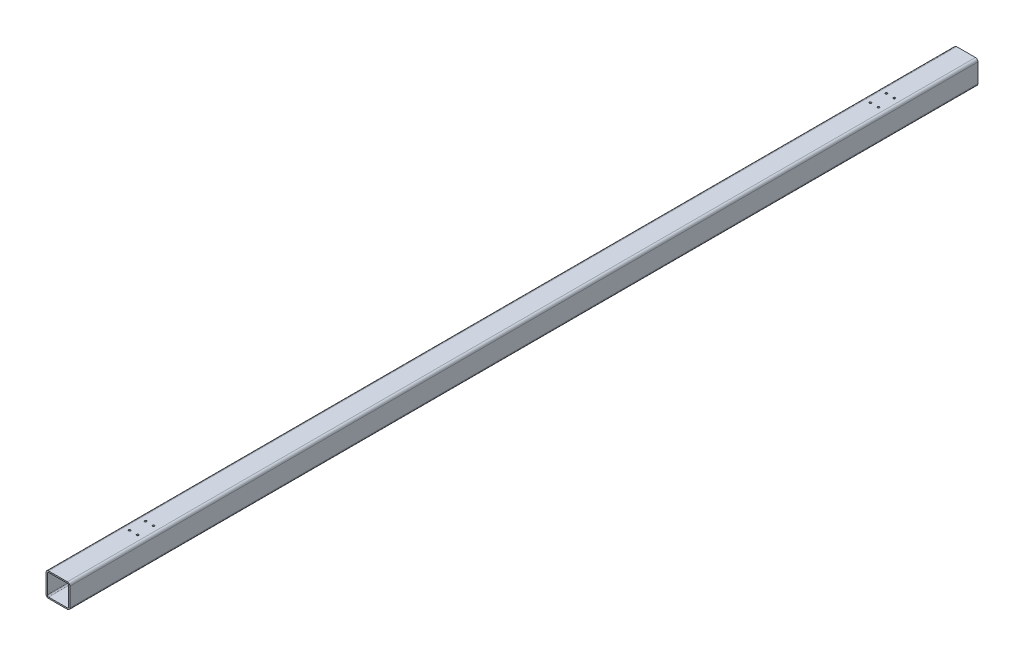
ISO-10303-21;
HEADER;
FILE_DESCRIPTION(('STEP AP214'),'2;1');
FILE_NAME('part.step','',(''),(''),'','','');
FILE_SCHEMA(('AUTOMOTIVE_DESIGN { 1 0 10303 214 1 1 1 1 }'));
ENDSEC;
DATA;
#1=APPLICATION_CONTEXT('core data for automotive mechanical design processes');
#2=APPLICATION_PROTOCOL_DEFINITION('international standard','automotive_design',2000,#1);
#3=PRODUCT_CONTEXT('',#1,'mechanical');
#4=PRODUCT('Part','Part','',(#3));
#5=PRODUCT_RELATED_PRODUCT_CATEGORY('part','',(#4));
#6=PRODUCT_DEFINITION_FORMATION('','',#4);
#7=PRODUCT_DEFINITION_CONTEXT('part definition',#1,'design');
#8=PRODUCT_DEFINITION('design','',#6,#7);
#9=PRODUCT_DEFINITION_SHAPE('','',#8);
#10=(LENGTH_UNIT() NAMED_UNIT(*) SI_UNIT(.MILLI.,.METRE.));
#11=(NAMED_UNIT(*) PLANE_ANGLE_UNIT() SI_UNIT($,.RADIAN.));
#12=(NAMED_UNIT(*) SI_UNIT($,.STERADIAN.) SOLID_ANGLE_UNIT());
#13=UNCERTAINTY_MEASURE_WITH_UNIT(LENGTH_MEASURE(1.E-05),#10,'distance_accuracy_value','');
#14=(GEOMETRIC_REPRESENTATION_CONTEXT(3) GLOBAL_UNCERTAINTY_ASSIGNED_CONTEXT((#13)) GLOBAL_UNIT_ASSIGNED_CONTEXT((#10,
#11,#12)) REPRESENTATION_CONTEXT('',''));
#15=CARTESIAN_POINT('',(0.,0.,0.));
#16=DIRECTION('',(0.,0.,1.));
#17=DIRECTION('',(1.,0.,0.));
#18=AXIS2_PLACEMENT_3D('',#15,#16,#17);
#19=CARTESIAN_POINT('',(649.999999999995,-30.,999.999999999987));
#20=DIRECTION('',(0.,-1.,0.));
#21=DIRECTION('',(0.,0.,-1.));
#22=AXIS2_PLACEMENT_3D('',#19,#20,#21);
#23=CYLINDRICAL_SURFACE('',#22,2.49999999999995);
#24=CARTESIAN_POINT('',(649.999999999995,-26.7999999999999,999.999999999987));
#25=DIRECTION('',(0.,-1.,0.));
#26=DIRECTION('',(0.,0.,-1.));
#27=AXIS2_PLACEMENT_3D('',#24,#25,#26);
#28=CIRCLE('',#27,2.49999999999995);
#29=CARTESIAN_POINT('',(649.999999999995,-26.7999999999999,997.499999999987));
#30=VERTEX_POINT('',#29);
#31=EDGE_CURVE('E20',#30,#30,#28,.T.);
#32=ORIENTED_EDGE('',*,*,#31,.F.);
#33=EDGE_LOOP('',(#32));
#34=FACE_BOUND('',#33,.T.);
#35=CARTESIAN_POINT('',(649.999999999995,-30.,999.999999999987));
#36=DIRECTION('',(0.,-1.,0.));
#37=DIRECTION('',(0.,0.,-1.));
#38=AXIS2_PLACEMENT_3D('',#35,#36,#37);
#39=CIRCLE('',#38,2.49999999999995);
#40=CARTESIAN_POINT('',(649.999999999995,-30.,997.499999999987));
#41=VERTEX_POINT('',#40);
#42=EDGE_CURVE('E186',#41,#41,#39,.T.);
#43=ORIENTED_EDGE('',*,*,#42,.T.);
#44=EDGE_LOOP('',(#43));
#45=FACE_BOUND('',#44,.T.);
#46=ADVANCED_FACE('F17',(#34,#45),#23,.F.);
#47=CARTESIAN_POINT('',(649.999999999995,-30.,499.999999999986));
#48=DIRECTION('',(0.,-1.,0.));
#49=DIRECTION('',(0.,0.,-1.));
#50=AXIS2_PLACEMENT_3D('',#47,#48,#49);
#51=CYLINDRICAL_SURFACE('',#50,2.49999999999995);
#52=CARTESIAN_POINT('',(649.999999999995,-26.7999999999999,499.999999999986));
#53=DIRECTION('',(0.,-1.,0.));
#54=DIRECTION('',(0.,0.,-1.));
#55=AXIS2_PLACEMENT_3D('',#52,#53,#54);
#56=CIRCLE('',#55,2.49999999999995);
#57=CARTESIAN_POINT('',(649.999999999995,-26.7999999999999,497.499999999986));
#58=VERTEX_POINT('',#57);
#59=EDGE_CURVE('E304',#58,#58,#56,.T.);
#60=ORIENTED_EDGE('',*,*,#59,.F.);
#61=EDGE_LOOP('',(#60));
#62=FACE_BOUND('',#61,.T.);
#63=CARTESIAN_POINT('',(649.999999999995,-30.,499.999999999986));
#64=DIRECTION('',(0.,-1.,0.));
#65=DIRECTION('',(0.,0.,-1.));
#66=AXIS2_PLACEMENT_3D('',#63,#64,#65);
#67=CIRCLE('',#66,2.49999999999995);
#68=CARTESIAN_POINT('',(649.999999999995,-30.,497.499999999986));
#69=VERTEX_POINT('',#68);
#70=EDGE_CURVE('E270',#69,#69,#67,.T.);
#71=ORIENTED_EDGE('',*,*,#70,.T.);
#72=EDGE_LOOP('',(#71));
#73=FACE_BOUND('',#72,.T.);
#74=ADVANCED_FACE('F315',(#62,#73),#51,.F.);
#75=CARTESIAN_POINT('',(650.000000000009,-30.,0.));
#76=DIRECTION('',(0.,-1.,0.));
#77=DIRECTION('',(0.,0.,-1.));
#78=AXIS2_PLACEMENT_3D('',#75,#76,#77);
#79=CYLINDRICAL_SURFACE('',#78,2.49999999999995);
#80=CARTESIAN_POINT('',(650.000000000009,-26.7999999999999,0.));
#81=DIRECTION('',(0.,-1.,0.));
#82=DIRECTION('',(0.,0.,-1.));
#83=AXIS2_PLACEMENT_3D('',#80,#81,#82);
#84=CIRCLE('',#83,2.49999999999995);
#85=CARTESIAN_POINT('',(650.000000000009,-26.7999999999999,-2.49999999999998));
#86=VERTEX_POINT('',#85);
#87=EDGE_CURVE('E302',#86,#86,#84,.T.);
#88=ORIENTED_EDGE('',*,*,#87,.F.);
#89=EDGE_LOOP('',(#88));
#90=FACE_BOUND('',#89,.T.);
#91=CARTESIAN_POINT('',(650.000000000009,-30.,0.));
#92=DIRECTION('',(0.,-1.,0.));
#93=DIRECTION('',(0.,0.,-1.));
#94=AXIS2_PLACEMENT_3D('',#91,#92,#93);
#95=CIRCLE('',#94,2.49999999999995);
#96=CARTESIAN_POINT('',(650.000000000009,-30.,-2.49999999999998));
#97=VERTEX_POINT('',#96);
#98=EDGE_CURVE('E267',#97,#97,#95,.T.);
#99=ORIENTED_EDGE('',*,*,#98,.T.);
#100=EDGE_LOOP('',(#99));
#101=FACE_BOUND('',#100,.T.);
#102=ADVANCED_FACE('F483',(#90,#101),#79,.F.);
#103=CARTESIAN_POINT('',(649.999999999995,-30.,-500.000000000014));
#104=DIRECTION('',(0.,-1.,0.));
#105=DIRECTION('',(0.,0.,-1.));
#106=AXIS2_PLACEMENT_3D('',#103,#104,#105);
#107=CYLINDRICAL_SURFACE('',#106,2.49999999999995);
#108=CARTESIAN_POINT('',(649.999999999995,-26.7999999999999,-500.000000000014));
#109=DIRECTION('',(0.,-1.,0.));
#110=DIRECTION('',(0.,0.,-1.));
#111=AXIS2_PLACEMENT_3D('',#108,#109,#110);
#112=CIRCLE('',#111,2.49999999999995);
#113=CARTESIAN_POINT('',(649.999999999995,-26.7999999999999,-502.500000000014));
#114=VERTEX_POINT('',#113);
#115=EDGE_CURVE('E299',#114,#114,#112,.T.);
#116=ORIENTED_EDGE('',*,*,#115,.F.);
#117=EDGE_LOOP('',(#116));
#118=FACE_BOUND('',#117,.T.);
#119=CARTESIAN_POINT('',(649.999999999995,-30.,-500.000000000014));
#120=DIRECTION('',(0.,-1.,0.));
#121=DIRECTION('',(0.,0.,-1.));
#122=AXIS2_PLACEMENT_3D('',#119,#120,#121);
#123=CIRCLE('',#122,2.49999999999995);
#124=CARTESIAN_POINT('',(649.999999999995,-30.,-502.500000000014));
#125=VERTEX_POINT('',#124);
#126=EDGE_CURVE('E264',#125,#125,#123,.T.);
#127=ORIENTED_EDGE('',*,*,#126,.T.);
#128=EDGE_LOOP('',(#127));
#129=FACE_BOUND('',#128,.T.);
#130=ADVANCED_FACE('F479',(#118,#129),#107,.F.);
#131=CARTESIAN_POINT('',(649.999999999995,-30.,-1000.));
#132=DIRECTION('',(0.,-1.,0.));
#133=DIRECTION('',(0.,0.,-1.));
#134=AXIS2_PLACEMENT_3D('',#131,#132,#133);
#135=CYLINDRICAL_SURFACE('',#134,2.49999999999995);
#136=CARTESIAN_POINT('',(649.999999999995,-26.7999999999999,-1000.));
#137=DIRECTION('',(0.,-1.,0.));
#138=DIRECTION('',(0.,0.,-1.));
#139=AXIS2_PLACEMENT_3D('',#136,#137,#138);
#140=CIRCLE('',#139,2.49999999999995);
#141=CARTESIAN_POINT('',(649.999999999995,-26.7999999999999,-1002.5));
#142=VERTEX_POINT('',#141);
#143=EDGE_CURVE('E200',#142,#142,#140,.T.);
#144=ORIENTED_EDGE('',*,*,#143,.F.);
#145=EDGE_LOOP('',(#144));
#146=FACE_BOUND('',#145,.T.);
#147=CARTESIAN_POINT('',(649.999999999995,-30.,-1000.));
#148=DIRECTION('',(0.,-1.,0.));
#149=DIRECTION('',(0.,0.,-1.));
#150=AXIS2_PLACEMENT_3D('',#147,#148,#149);
#151=CIRCLE('',#150,2.49999999999995);
#152=CARTESIAN_POINT('',(649.999999999995,-30.,-1002.5));
#153=VERTEX_POINT('',#152);
#154=EDGE_CURVE('E182',#153,#153,#151,.T.);
#155=ORIENTED_EDGE('',*,*,#154,.T.);
#156=EDGE_LOOP('',(#155));
#157=FACE_BOUND('',#156,.T.);
#158=ADVANCED_FACE('F475',(#146,#157),#135,.F.);
#159=CARTESIAN_POINT('',(660.,40.,-950.));
#160=DIRECTION('',(0.,1.,0.));
#161=DIRECTION('',(0.,0.,1.));
#162=AXIS2_PLACEMENT_3D('',#159,#160,#161);
#163=CYLINDRICAL_SURFACE('',#162,2.49999999999995);
#164=CARTESIAN_POINT('',(660.,30.,-950.));
#165=DIRECTION('',(0.,1.,0.));
#166=DIRECTION('',(0.,0.,1.));
#167=AXIS2_PLACEMENT_3D('',#164,#165,#166);
#168=CIRCLE('',#167,2.49999999999995);
#169=CARTESIAN_POINT('',(660.,30.,-947.5));
#170=VERTEX_POINT('',#169);
#171=EDGE_CURVE('E176',#170,#170,#168,.T.);
#172=ORIENTED_EDGE('',*,*,#171,.T.);
#173=EDGE_LOOP('',(#172));
#174=FACE_BOUND('',#173,.T.);
#175=CARTESIAN_POINT('',(660.,26.7999999999999,-950.));
#176=DIRECTION('',(0.,1.,0.));
#177=DIRECTION('',(0.,0.,1.));
#178=AXIS2_PLACEMENT_3D('',#175,#176,#177);
#179=CIRCLE('',#178,2.49999999999995);
#180=CARTESIAN_POINT('',(660.,26.7999999999999,-947.5));
#181=VERTEX_POINT('',#180);
#182=EDGE_CURVE('E142',#181,#181,#179,.T.);
#183=ORIENTED_EDGE('',*,*,#182,.F.);
#184=EDGE_LOOP('',(#183));
#185=FACE_BOUND('',#184,.T.);
#186=ADVANCED_FACE('F471',(#174,#185),#163,.F.);
#187=CARTESIAN_POINT('',(680.,40.,-950.));
#188=DIRECTION('',(0.,1.,0.));
#189=DIRECTION('',(0.,0.,1.));
#190=AXIS2_PLACEMENT_3D('',#187,#188,#189);
#191=CYLINDRICAL_SURFACE('',#190,2.49999999999995);
#192=CARTESIAN_POINT('',(680.,30.,-950.));
#193=DIRECTION('',(0.,1.,0.));
#194=DIRECTION('',(0.,0.,1.));
#195=AXIS2_PLACEMENT_3D('',#192,#193,#194);
#196=CIRCLE('',#195,2.49999999999995);
#197=CARTESIAN_POINT('',(680.,30.,-947.5));
#198=VERTEX_POINT('',#197);
#199=EDGE_CURVE('E257',#198,#198,#196,.T.);
#200=ORIENTED_EDGE('',*,*,#199,.T.);
#201=EDGE_LOOP('',(#200));
#202=FACE_BOUND('',#201,.T.);
#203=CARTESIAN_POINT('',(680.,26.7999999999999,-950.));
#204=DIRECTION('',(0.,1.,0.));
#205=DIRECTION('',(0.,0.,1.));
#206=AXIS2_PLACEMENT_3D('',#203,#204,#205);
#207=CIRCLE('',#206,2.49999999999995);
#208=CARTESIAN_POINT('',(680.,26.7999999999999,-947.5));
#209=VERTEX_POINT('',#208);
#210=EDGE_CURVE('E292',#209,#209,#207,.T.);
#211=ORIENTED_EDGE('',*,*,#210,.F.);
#212=EDGE_LOOP('',(#211));
#213=FACE_BOUND('',#212,.T.);
#214=ADVANCED_FACE('F467',(#202,#213),#191,.F.);
#215=CARTESIAN_POINT('',(660.,40.,-910.));
#216=DIRECTION('',(0.,1.,0.));
#217=DIRECTION('',(0.,0.,1.));
#218=AXIS2_PLACEMENT_3D('',#215,#216,#217);
#219=CYLINDRICAL_SURFACE('',#218,2.49999999999995);
#220=CARTESIAN_POINT('',(660.,30.,-910.));
#221=DIRECTION('',(0.,1.,0.));
#222=DIRECTION('',(0.,0.,1.));
#223=AXIS2_PLACEMENT_3D('',#220,#221,#222);
#224=CIRCLE('',#223,2.49999999999995);
#225=CARTESIAN_POINT('',(660.,30.,-907.5));
#226=VERTEX_POINT('',#225);
#227=EDGE_CURVE('E254',#226,#226,#224,.T.);
#228=ORIENTED_EDGE('',*,*,#227,.T.);
#229=EDGE_LOOP('',(#228));
#230=FACE_BOUND('',#229,.T.);
#231=CARTESIAN_POINT('',(660.,26.7999999999999,-910.));
#232=DIRECTION('',(0.,1.,0.));
#233=DIRECTION('',(0.,0.,1.));
#234=AXIS2_PLACEMENT_3D('',#231,#232,#233);
#235=CIRCLE('',#234,2.49999999999995);
#236=CARTESIAN_POINT('',(660.,26.7999999999999,-907.5));
#237=VERTEX_POINT('',#236);
#238=EDGE_CURVE('E289',#237,#237,#235,.T.);
#239=ORIENTED_EDGE('',*,*,#238,.F.);
#240=EDGE_LOOP('',(#239));
#241=FACE_BOUND('',#240,.T.);
#242=ADVANCED_FACE('F463',(#230,#241),#219,.F.);
#243=CARTESIAN_POINT('',(680.,40.,-910.));
#244=DIRECTION('',(0.,1.,0.));
#245=DIRECTION('',(0.,0.,1.));
#246=AXIS2_PLACEMENT_3D('',#243,#244,#245);
#247=CYLINDRICAL_SURFACE('',#246,2.49999999999995);
#248=CARTESIAN_POINT('',(680.,30.,-910.));
#249=DIRECTION('',(0.,1.,0.));
#250=DIRECTION('',(0.,0.,1.));
#251=AXIS2_PLACEMENT_3D('',#248,#249,#250);
#252=CIRCLE('',#251,2.49999999999995);
#253=CARTESIAN_POINT('',(680.,30.,-907.5));
#254=VERTEX_POINT('',#253);
#255=EDGE_CURVE('E251',#254,#254,#252,.T.);
#256=ORIENTED_EDGE('',*,*,#255,.T.);
#257=EDGE_LOOP('',(#256));
#258=FACE_BOUND('',#257,.T.);
#259=CARTESIAN_POINT('',(680.,26.7999999999999,-910.));
#260=DIRECTION('',(0.,1.,0.));
#261=DIRECTION('',(0.,0.,1.));
#262=AXIS2_PLACEMENT_3D('',#259,#260,#261);
#263=CIRCLE('',#262,2.49999999999995);
#264=CARTESIAN_POINT('',(680.,26.7999999999999,-907.5));
#265=VERTEX_POINT('',#264);
#266=EDGE_CURVE('E286',#265,#265,#263,.T.);
#267=ORIENTED_EDGE('',*,*,#266,.F.);
#268=EDGE_LOOP('',(#267));
#269=FACE_BOUND('',#268,.T.);
#270=ADVANCED_FACE('F459',(#258,#269),#247,.F.);
#271=CARTESIAN_POINT('',(660.,40.,910.));
#272=DIRECTION('',(0.,1.,0.));
#273=DIRECTION('',(0.,0.,1.));
#274=AXIS2_PLACEMENT_3D('',#271,#272,#273);
#275=CYLINDRICAL_SURFACE('',#274,2.49999999999995);
#276=CARTESIAN_POINT('',(660.,30.,910.));
#277=DIRECTION('',(0.,1.,0.));
#278=DIRECTION('',(0.,0.,1.));
#279=AXIS2_PLACEMENT_3D('',#276,#277,#278);
#280=CIRCLE('',#279,2.49999999999995);
#281=CARTESIAN_POINT('',(660.,30.,912.5));
#282=VERTEX_POINT('',#281);
#283=EDGE_CURVE('E248',#282,#282,#280,.T.);
#284=ORIENTED_EDGE('',*,*,#283,.T.);
#285=EDGE_LOOP('',(#284));
#286=FACE_BOUND('',#285,.T.);
#287=CARTESIAN_POINT('',(660.,26.7999999999999,910.));
#288=DIRECTION('',(0.,1.,0.));
#289=DIRECTION('',(0.,0.,1.));
#290=AXIS2_PLACEMENT_3D('',#287,#288,#289);
#291=CIRCLE('',#290,2.49999999999995);
#292=CARTESIAN_POINT('',(660.,26.7999999999999,912.5));
#293=VERTEX_POINT('',#292);
#294=EDGE_CURVE('E283',#293,#293,#291,.T.);
#295=ORIENTED_EDGE('',*,*,#294,.F.);
#296=EDGE_LOOP('',(#295));
#297=FACE_BOUND('',#296,.T.);
#298=ADVANCED_FACE('F455',(#286,#297),#275,.F.);
#299=CARTESIAN_POINT('',(680.,40.,910.));
#300=DIRECTION('',(0.,1.,0.));
#301=DIRECTION('',(0.,0.,1.));
#302=AXIS2_PLACEMENT_3D('',#299,#300,#301);
#303=CYLINDRICAL_SURFACE('',#302,2.49999999999995);
#304=CARTESIAN_POINT('',(680.,30.,910.));
#305=DIRECTION('',(0.,1.,0.));
#306=DIRECTION('',(0.,0.,1.));
#307=AXIS2_PLACEMENT_3D('',#304,#305,#306);
#308=CIRCLE('',#307,2.49999999999995);
#309=CARTESIAN_POINT('',(680.,30.,912.5));
#310=VERTEX_POINT('',#309);
#311=EDGE_CURVE('E245',#310,#310,#308,.T.);
#312=ORIENTED_EDGE('',*,*,#311,.T.);
#313=EDGE_LOOP('',(#312));
#314=FACE_BOUND('',#313,.T.);
#315=CARTESIAN_POINT('',(680.,26.7999999999999,910.));
#316=DIRECTION('',(0.,1.,0.));
#317=DIRECTION('',(0.,0.,1.));
#318=AXIS2_PLACEMENT_3D('',#315,#316,#317);
#319=CIRCLE('',#318,2.49999999999995);
#320=CARTESIAN_POINT('',(680.,26.7999999999999,912.5));
#321=VERTEX_POINT('',#320);
#322=EDGE_CURVE('E280',#321,#321,#319,.T.);
#323=ORIENTED_EDGE('',*,*,#322,.F.);
#324=EDGE_LOOP('',(#323));
#325=FACE_BOUND('',#324,.T.);
#326=ADVANCED_FACE('F451',(#314,#325),#303,.F.);
#327=CARTESIAN_POINT('',(660.,40.,950.));
#328=DIRECTION('',(0.,1.,0.));
#329=DIRECTION('',(0.,0.,1.));
#330=AXIS2_PLACEMENT_3D('',#327,#328,#329);
#331=CYLINDRICAL_SURFACE('',#330,2.49999999999995);
#332=CARTESIAN_POINT('',(660.,30.,950.));
#333=DIRECTION('',(0.,1.,0.));
#334=DIRECTION('',(0.,0.,1.));
#335=AXIS2_PLACEMENT_3D('',#332,#333,#334);
#336=CIRCLE('',#335,2.49999999999995);
#337=CARTESIAN_POINT('',(660.,30.,952.5));
#338=VERTEX_POINT('',#337);
#339=EDGE_CURVE('E242',#338,#338,#336,.T.);
#340=ORIENTED_EDGE('',*,*,#339,.T.);
#341=EDGE_LOOP('',(#340));
#342=FACE_BOUND('',#341,.T.);
#343=CARTESIAN_POINT('',(660.,26.7999999999999,950.));
#344=DIRECTION('',(0.,1.,0.));
#345=DIRECTION('',(0.,0.,1.));
#346=AXIS2_PLACEMENT_3D('',#343,#344,#345);
#347=CIRCLE('',#346,2.49999999999995);
#348=CARTESIAN_POINT('',(660.,26.7999999999999,952.5));
#349=VERTEX_POINT('',#348);
#350=EDGE_CURVE('E277',#349,#349,#347,.T.);
#351=ORIENTED_EDGE('',*,*,#350,.F.);
#352=EDGE_LOOP('',(#351));
#353=FACE_BOUND('',#352,.T.);
#354=ADVANCED_FACE('F447',(#342,#353),#331,.F.);
#355=CARTESIAN_POINT('',(680.,40.,950.));
#356=DIRECTION('',(0.,1.,0.));
#357=DIRECTION('',(0.,0.,1.));
#358=AXIS2_PLACEMENT_3D('',#355,#356,#357);
#359=CYLINDRICAL_SURFACE('',#358,2.49999999999995);
#360=CARTESIAN_POINT('',(680.,30.,950.));
#361=DIRECTION('',(0.,1.,0.));
#362=DIRECTION('',(0.,0.,1.));
#363=AXIS2_PLACEMENT_3D('',#360,#361,#362);
#364=CIRCLE('',#363,2.49999999999995);
#365=CARTESIAN_POINT('',(680.,30.,952.5));
#366=VERTEX_POINT('',#365);
#367=EDGE_CURVE('E173',#366,#366,#364,.T.);
#368=ORIENTED_EDGE('',*,*,#367,.T.);
#369=EDGE_LOOP('',(#368));
#370=FACE_BOUND('',#369,.T.);
#371=CARTESIAN_POINT('',(680.,26.7999999999999,950.));
#372=DIRECTION('',(0.,1.,0.));
#373=DIRECTION('',(0.,0.,1.));
#374=AXIS2_PLACEMENT_3D('',#371,#372,#373);
#375=CIRCLE('',#374,2.49999999999995);
#376=CARTESIAN_POINT('',(680.,26.7999999999999,952.5));
#377=VERTEX_POINT('',#376);
#378=EDGE_CURVE('E192',#377,#377,#375,.T.);
#379=ORIENTED_EDGE('',*,*,#378,.F.);
#380=EDGE_LOOP('',(#379));
#381=FACE_BOUND('',#380,.T.);
#382=ADVANCED_FACE('F444',(#370,#381),#359,.F.);
#383=CARTESIAN_POINT('',(646.4,-23.6000000000001,1170.));
#384=DIRECTION('',(0.,0.,-1.));
#385=DIRECTION('',(-1.,0.,0.));
#386=AXIS2_PLACEMENT_3D('',#383,#384,#385);
#387=CYLINDRICAL_SURFACE('',#386,3.19999999999998);
#388=CARTESIAN_POINT('',(646.4,-23.6000000000001,-1140.));
#389=DIRECTION('',(0.,0.,-1.));
#390=DIRECTION('',(-1.,0.,0.));
#391=AXIS2_PLACEMENT_3D('',#388,#389,#390);
#392=CIRCLE('',#391,3.19999999999998);
#393=CARTESIAN_POINT('',(643.2,-23.6000000000001,-1140.));
#394=VERTEX_POINT('',#393);
#395=CARTESIAN_POINT('',(646.4,-26.7999999999999,-1140.));
#396=VERTEX_POINT('',#395);
#397=EDGE_CURVE('E222',#394,#396,#392,.F.);
#398=ORIENTED_EDGE('',*,*,#397,.F.);
#399=DIRECTION('',(0.,0.,1.));
#400=VECTOR('',#399,1.);
#401=CARTESIAN_POINT('',(643.2,-23.6000000000001,1170.));
#402=LINE('',#401,#400);
#403=CARTESIAN_POINT('',(643.2,-23.6000000000001,1140.));
#404=VERTEX_POINT('',#403);
#405=EDGE_CURVE('E187',#404,#394,#402,.F.);
#406=ORIENTED_EDGE('',*,*,#405,.F.);
#407=CARTESIAN_POINT('',(646.4,-23.6000000000001,1140.));
#408=DIRECTION('',(0.,0.,-1.));
#409=DIRECTION('',(-1.,0.,0.));
#410=AXIS2_PLACEMENT_3D('',#407,#408,#409);
#411=CIRCLE('',#410,3.19999999999998);
#412=CARTESIAN_POINT('',(646.4,-26.7999999999999,1140.));
#413=VERTEX_POINT('',#412);
#414=EDGE_CURVE('E238',#413,#404,#411,.T.);
#415=ORIENTED_EDGE('',*,*,#414,.F.);
#416=DIRECTION('',(0.,0.,1.));
#417=VECTOR('',#416,1.);
#418=CARTESIAN_POINT('',(646.4,-26.7999999999999,1170.));
#419=LINE('',#418,#417);
#420=EDGE_CURVE('E198',#396,#413,#419,.T.);
#421=ORIENTED_EDGE('',*,*,#420,.F.);
#422=EDGE_LOOP('',(#398,#406,#415,#421));
#423=FACE_BOUND('',#422,.T.);
#424=ADVANCED_FACE('F424',(#423),#387,.F.);
#425=CARTESIAN_POINT('',(646.4,-26.7999999999999,1170.));
#426=DIRECTION('',(0.,1.,0.));
#427=DIRECTION('',(-1.,0.,0.));
#428=AXIS2_PLACEMENT_3D('',#425,#426,#427);
#429=PLANE('',#428);
#430=ORIENTED_EDGE('',*,*,#420,.T.);
#431=DIRECTION('',(1.,0.,0.));
#432=VECTOR('',#431,1.);
#433=CARTESIAN_POINT('',(693.6,-26.7999999999999,1140.));
#434=LINE('',#433,#432);
#435=CARTESIAN_POINT('',(693.6,-26.8,1140.));
#436=VERTEX_POINT('',#435);
#437=EDGE_CURVE('E159',#436,#413,#434,.F.);
#438=ORIENTED_EDGE('',*,*,#437,.F.);
#439=DIRECTION('',(0.,0.,-1.));
#440=VECTOR('',#439,1.);
#441=CARTESIAN_POINT('',(693.6,-26.8,1170.));
#442=LINE('',#441,#440);
#443=CARTESIAN_POINT('',(693.6,-26.8,-1140.));
#444=VERTEX_POINT('',#443);
#445=EDGE_CURVE('E195',#436,#444,#442,.T.);
#446=ORIENTED_EDGE('',*,*,#445,.T.);
#447=DIRECTION('',(-1.,0.,0.));
#448=VECTOR('',#447,1.);
#449=CARTESIAN_POINT('',(646.4,-26.7999999999999,-1140.));
#450=LINE('',#449,#448);
#451=EDGE_CURVE('E221',#396,#444,#450,.F.);
#452=ORIENTED_EDGE('',*,*,#451,.F.);
#453=EDGE_LOOP('',(#430,#438,#446,#452));
#454=FACE_BOUND('',#453,.T.);
#455=ORIENTED_EDGE('',*,*,#143,.T.);
#456=EDGE_LOOP('',(#455));
#457=FACE_BOUND('',#456,.T.);
#458=ORIENTED_EDGE('',*,*,#115,.T.);
#459=EDGE_LOOP('',(#458));
#460=FACE_BOUND('',#459,.T.);
#461=ORIENTED_EDGE('',*,*,#87,.T.);
#462=EDGE_LOOP('',(#461));
#463=FACE_BOUND('',#462,.T.);
#464=ORIENTED_EDGE('',*,*,#59,.T.);
#465=EDGE_LOOP('',(#464));
#466=FACE_BOUND('',#465,.T.);
#467=ORIENTED_EDGE('',*,*,#31,.T.);
#468=EDGE_LOOP('',(#467));
#469=FACE_BOUND('',#468,.T.);
#470=ADVANCED_FACE('F311',(#454,#457,#460,#463,#466,#469),#429,.T.);
#471=CARTESIAN_POINT('',(693.6,-23.6000000000001,1170.));
#472=DIRECTION('',(0.,0.,-1.));
#473=DIRECTION('',(-1.,0.,0.));
#474=AXIS2_PLACEMENT_3D('',#471,#472,#473);
#475=CYLINDRICAL_SURFACE('',#474,3.19999999999998);
#476=CARTESIAN_POINT('',(693.6,-23.6000000000001,-1140.));
#477=DIRECTION('',(0.,0.,-1.));
#478=DIRECTION('',(-1.,0.,0.));
#479=AXIS2_PLACEMENT_3D('',#476,#477,#478);
#480=CIRCLE('',#479,3.19999999999998);
#481=CARTESIAN_POINT('',(696.8,-23.6000000000001,-1140.));
#482=VERTEX_POINT('',#481);
#483=EDGE_CURVE('E219',#444,#482,#480,.F.);
#484=ORIENTED_EDGE('',*,*,#483,.F.);
#485=ORIENTED_EDGE('',*,*,#445,.F.);
#486=CARTESIAN_POINT('',(693.6,-23.6000000000001,1140.));
#487=DIRECTION('',(0.,0.,-1.));
#488=DIRECTION('',(-1.,0.,0.));
#489=AXIS2_PLACEMENT_3D('',#486,#487,#488);
#490=CIRCLE('',#489,3.19999999999998);
#491=CARTESIAN_POINT('',(696.8,-23.6000000000001,1140.));
#492=VERTEX_POINT('',#491);
#493=EDGE_CURVE('E157',#492,#436,#490,.T.);
#494=ORIENTED_EDGE('',*,*,#493,.F.);
#495=DIRECTION('',(0.,0.,1.));
#496=VECTOR('',#495,1.);
#497=CARTESIAN_POINT('',(696.8,-23.6000000000001,1170.));
#498=LINE('',#497,#496);
#499=EDGE_CURVE('E143',#482,#492,#498,.T.);
#500=ORIENTED_EDGE('',*,*,#499,.F.);
#501=EDGE_LOOP('',(#484,#485,#494,#500));
#502=FACE_BOUND('',#501,.T.);
#503=ADVANCED_FACE('F431',(#502),#475,.F.);
#504=CARTESIAN_POINT('',(696.8,23.6000000000001,1170.));
#505=DIRECTION('',(-1.,0.,0.));
#506=DIRECTION('',(0.,0.,1.));
#507=AXIS2_PLACEMENT_3D('',#504,#505,#506);
#508=PLANE('',#507);
#509=ORIENTED_EDGE('',*,*,#499,.T.);
#510=DIRECTION('',(0.,1.,0.));
#511=VECTOR('',#510,1.);
#512=CARTESIAN_POINT('',(696.8,300.,1140.));
#513=LINE('',#512,#511);
#514=CARTESIAN_POINT('',(696.8,23.6000000000001,1140.));
#515=VERTEX_POINT('',#514);
#516=EDGE_CURVE('E150',#515,#492,#513,.F.);
#517=ORIENTED_EDGE('',*,*,#516,.F.);
#518=DIRECTION('',(0.,0.,-1.));
#519=VECTOR('',#518,1.);
#520=CARTESIAN_POINT('',(696.8,23.6000000000001,1170.));
#521=LINE('',#520,#519);
#522=CARTESIAN_POINT('',(696.8,23.6000000000001,-1140.));
#523=VERTEX_POINT('',#522);
#524=EDGE_CURVE('E134',#515,#523,#521,.T.);
#525=ORIENTED_EDGE('',*,*,#524,.T.);
#526=DIRECTION('',(0.,1.,0.));
#527=VECTOR('',#526,1.);
#528=CARTESIAN_POINT('',(696.8,300.,-1140.));
#529=LINE('',#528,#527);
#530=EDGE_CURVE('E218',#482,#523,#529,.T.);
#531=ORIENTED_EDGE('',*,*,#530,.F.);
#532=EDGE_LOOP('',(#509,#517,#525,#531));
#533=FACE_BOUND('',#532,.T.);
#534=ADVANCED_FACE('F155',(#533),#508,.T.);
#535=CARTESIAN_POINT('',(693.6,23.6000000000001,1170.));
#536=DIRECTION('',(0.,0.,-1.));
#537=DIRECTION('',(-1.,0.,0.));
#538=AXIS2_PLACEMENT_3D('',#535,#536,#537);
#539=CYLINDRICAL_SURFACE('',#538,3.19999999999998);
#540=CARTESIAN_POINT('',(693.6,23.6000000000001,-1140.));
#541=DIRECTION('',(0.,0.,-1.));
#542=DIRECTION('',(-1.,0.,0.));
#543=AXIS2_PLACEMENT_3D('',#540,#541,#542);
#544=CIRCLE('',#543,3.19999999999998);
#545=CARTESIAN_POINT('',(693.6,26.7999999999999,-1140.));
#546=VERTEX_POINT('',#545);
#547=EDGE_CURVE('E138',#523,#546,#544,.F.);
#548=ORIENTED_EDGE('',*,*,#547,.F.);
#549=ORIENTED_EDGE('',*,*,#524,.F.);
#550=CARTESIAN_POINT('',(693.6,23.6000000000001,1140.));
#551=DIRECTION('',(0.,0.,-1.));
#552=DIRECTION('',(-1.,0.,0.));
#553=AXIS2_PLACEMENT_3D('',#550,#551,#552);
#554=CIRCLE('',#553,3.19999999999998);
#555=CARTESIAN_POINT('',(693.6,26.7999999999999,1140.));
#556=VERTEX_POINT('',#555);
#557=EDGE_CURVE('E137',#556,#515,#554,.T.);
#558=ORIENTED_EDGE('',*,*,#557,.F.);
#559=DIRECTION('',(0.,0.,1.));
#560=VECTOR('',#559,1.);
#561=CARTESIAN_POINT('',(693.6,26.7999999999999,1170.));
#562=LINE('',#561,#560);
#563=EDGE_CURVE('E127',#546,#556,#562,.T.);
#564=ORIENTED_EDGE('',*,*,#563,.F.);
#565=EDGE_LOOP('',(#548,#549,#558,#564));
#566=FACE_BOUND('',#565,.T.);
#567=ADVANCED_FACE('F136',(#566),#539,.F.);
#568=CARTESIAN_POINT('',(693.6,26.7999999999999,1170.));
#569=DIRECTION('',(0.,-1.,0.));
#570=DIRECTION('',(1.,0.,0.));
#571=AXIS2_PLACEMENT_3D('',#568,#569,#570);
#572=PLANE('',#571);
#573=ORIENTED_EDGE('',*,*,#563,.T.);
#574=DIRECTION('',(1.,0.,0.));
#575=VECTOR('',#574,1.);
#576=CARTESIAN_POINT('',(693.6,26.7999999999999,1140.));
#577=LINE('',#576,#575);
#578=CARTESIAN_POINT('',(646.4,26.8,1140.));
#579=VERTEX_POINT('',#578);
#580=EDGE_CURVE('E153',#579,#556,#577,.T.);
#581=ORIENTED_EDGE('',*,*,#580,.F.);
#582=DIRECTION('',(0.,0.,-1.));
#583=VECTOR('',#582,1.);
#584=CARTESIAN_POINT('',(646.4,26.8,1170.));
#585=LINE('',#584,#583);
#586=CARTESIAN_POINT('',(646.4,26.8,-1140.));
#587=VERTEX_POINT('',#586);
#588=EDGE_CURVE('E189',#579,#587,#585,.T.);
#589=ORIENTED_EDGE('',*,*,#588,.T.);
#590=DIRECTION('',(-1.,0.,0.));
#591=VECTOR('',#590,1.);
#592=CARTESIAN_POINT('',(646.4,26.7999999999999,-1140.));
#593=LINE('',#592,#591);
#594=EDGE_CURVE('E216',#546,#587,#593,.T.);
#595=ORIENTED_EDGE('',*,*,#594,.F.);
#596=EDGE_LOOP('',(#573,#581,#589,#595));
#597=FACE_BOUND('',#596,.T.);
#598=ORIENTED_EDGE('',*,*,#378,.T.);
#599=EDGE_LOOP('',(#598));
#600=FACE_BOUND('',#599,.T.);
#601=ORIENTED_EDGE('',*,*,#350,.T.);
#602=EDGE_LOOP('',(#601));
#603=FACE_BOUND('',#602,.T.);
#604=ORIENTED_EDGE('',*,*,#322,.T.);
#605=EDGE_LOOP('',(#604));
#606=FACE_BOUND('',#605,.T.);
#607=ORIENTED_EDGE('',*,*,#294,.T.);
#608=EDGE_LOOP('',(#607));
#609=FACE_BOUND('',#608,.T.);
#610=ORIENTED_EDGE('',*,*,#266,.T.);
#611=EDGE_LOOP('',(#610));
#612=FACE_BOUND('',#611,.T.);
#613=ORIENTED_EDGE('',*,*,#238,.T.);
#614=EDGE_LOOP('',(#613));
#615=FACE_BOUND('',#614,.T.);
#616=ORIENTED_EDGE('',*,*,#210,.T.);
#617=EDGE_LOOP('',(#616));
#618=FACE_BOUND('',#617,.T.);
#619=ORIENTED_EDGE('',*,*,#182,.T.);
#620=EDGE_LOOP('',(#619));
#621=FACE_BOUND('',#620,.T.);
#622=ADVANCED_FACE('F398',(#597,#600,#603,#606,#609,#612,#615,#618,#621),#572,.T.);
#623=CARTESIAN_POINT('',(646.4,23.6000000000001,1170.));
#624=DIRECTION('',(0.,0.,-1.));
#625=DIRECTION('',(-1.,0.,0.));
#626=AXIS2_PLACEMENT_3D('',#623,#624,#625);
#627=CYLINDRICAL_SURFACE('',#626,3.19999999999998);
#628=CARTESIAN_POINT('',(646.4,23.6000000000001,-1140.));
#629=DIRECTION('',(0.,0.,-1.));
#630=DIRECTION('',(-1.,0.,0.));
#631=AXIS2_PLACEMENT_3D('',#628,#629,#630);
#632=CIRCLE('',#631,3.19999999999998);
#633=CARTESIAN_POINT('',(643.2,23.6000000000001,-1140.));
#634=VERTEX_POINT('',#633);
#635=EDGE_CURVE('E214',#587,#634,#632,.F.);
#636=ORIENTED_EDGE('',*,*,#635,.F.);
#637=ORIENTED_EDGE('',*,*,#588,.F.);
#638=CARTESIAN_POINT('',(646.4,23.6000000000001,1140.));
#639=DIRECTION('',(0.,0.,-1.));
#640=DIRECTION('',(-1.,0.,0.));
#641=AXIS2_PLACEMENT_3D('',#638,#639,#640);
#642=CIRCLE('',#641,3.19999999999998);
#643=CARTESIAN_POINT('',(643.2,23.6000000000001,1140.));
#644=VERTEX_POINT('',#643);
#645=EDGE_CURVE('E235',#644,#579,#642,.T.);
#646=ORIENTED_EDGE('',*,*,#645,.F.);
#647=DIRECTION('',(0.,0.,1.));
#648=VECTOR('',#647,1.);
#649=CARTESIAN_POINT('',(643.2,23.6000000000001,1170.));
#650=LINE('',#649,#648);
#651=EDGE_CURVE('E184',#634,#644,#650,.T.);
#652=ORIENTED_EDGE('',*,*,#651,.F.);
#653=EDGE_LOOP('',(#636,#637,#646,#652));
#654=FACE_BOUND('',#653,.T.);
#655=ADVANCED_FACE('F332',(#654),#627,.F.);
#656=CARTESIAN_POINT('',(643.2,-23.6000000000001,1170.));
#657=DIRECTION('',(1.,0.,0.));
#658=DIRECTION('',(0.,1.,0.));
#659=AXIS2_PLACEMENT_3D('',#656,#657,#658);
#660=PLANE('',#659);
#661=ORIENTED_EDGE('',*,*,#651,.T.);
#662=DIRECTION('',(0.,1.,0.));
#663=VECTOR('',#662,1.);
#664=CARTESIAN_POINT('',(643.2,300.,1140.));
#665=LINE('',#664,#663);
#666=EDGE_CURVE('E237',#404,#644,#665,.T.);
#667=ORIENTED_EDGE('',*,*,#666,.F.);
#668=ORIENTED_EDGE('',*,*,#405,.T.);
#669=DIRECTION('',(0.,1.,0.));
#670=VECTOR('',#669,1.);
#671=CARTESIAN_POINT('',(643.2,300.,-1140.));
#672=LINE('',#671,#670);
#673=EDGE_CURVE('E213',#634,#394,#672,.F.);
#674=ORIENTED_EDGE('',*,*,#673,.F.);
#675=EDGE_LOOP('',(#661,#667,#668,#674));
#676=FACE_BOUND('',#675,.T.);
#677=ADVANCED_FACE('F321',(#676),#660,.T.);
#678=CARTESIAN_POINT('',(646.4,-30.,1170.));
#679=DIRECTION('',(0.,1.,0.));
#680=DIRECTION('',(-1.,0.,0.));
#681=AXIS2_PLACEMENT_3D('',#678,#679,#680);
#682=PLANE('',#681);
#683=DIRECTION('',(0.,0.,-1.));
#684=VECTOR('',#683,1.);
#685=CARTESIAN_POINT('',(693.6,-30.0000000000001,1170.));
#686=LINE('',#685,#684);
#687=CARTESIAN_POINT('',(693.6,-30.0000000000001,1140.));
#688=VERTEX_POINT('',#687);
#689=CARTESIAN_POINT('',(693.6,-30.0000000000001,-1140.));
#690=VERTEX_POINT('',#689);
#691=EDGE_CURVE('E165',#688,#690,#686,.T.);
#692=ORIENTED_EDGE('',*,*,#691,.F.);
#693=DIRECTION('',(1.,0.,0.));
#694=VECTOR('',#693,1.);
#695=CARTESIAN_POINT('',(693.6,-30.,1140.));
#696=LINE('',#695,#694);
#697=CARTESIAN_POINT('',(646.4,-30.0000000000001,1140.));
#698=VERTEX_POINT('',#697);
#699=EDGE_CURVE('E226',#698,#688,#696,.T.);
#700=ORIENTED_EDGE('',*,*,#699,.F.);
#701=DIRECTION('',(0.,0.,-1.));
#702=VECTOR('',#701,1.);
#703=CARTESIAN_POINT('',(646.4,-30.0000000000001,1170.));
#704=LINE('',#703,#702);
#705=CARTESIAN_POINT('',(646.4,-30.0000000000001,-1140.));
#706=VERTEX_POINT('',#705);
#707=EDGE_CURVE('E180',#706,#698,#704,.F.);
#708=ORIENTED_EDGE('',*,*,#707,.F.);
#709=DIRECTION('',(-1.,0.,0.));
#710=VECTOR('',#709,1.);
#711=CARTESIAN_POINT('',(646.4,-30.,-1140.));
#712=LINE('',#711,#710);
#713=EDGE_CURVE('E209',#690,#706,#712,.T.);
#714=ORIENTED_EDGE('',*,*,#713,.F.);
#715=EDGE_LOOP('',(#692,#700,#708,#714));
#716=FACE_BOUND('',#715,.T.);
#717=ORIENTED_EDGE('',*,*,#154,.F.);
#718=EDGE_LOOP('',(#717));
#719=FACE_BOUND('',#718,.T.);
#720=ORIENTED_EDGE('',*,*,#126,.F.);
#721=EDGE_LOOP('',(#720));
#722=FACE_BOUND('',#721,.T.);
#723=ORIENTED_EDGE('',*,*,#98,.F.);
#724=EDGE_LOOP('',(#723));
#725=FACE_BOUND('',#724,.T.);
#726=ORIENTED_EDGE('',*,*,#70,.F.);
#727=EDGE_LOOP('',(#726));
#728=FACE_BOUND('',#727,.T.);
#729=ORIENTED_EDGE('',*,*,#42,.F.);
#730=EDGE_LOOP('',(#729));
#731=FACE_BOUND('',#730,.T.);
#732=ADVANCED_FACE('F318',(#716,#719,#722,#725,#728,#731),#682,.F.);
#733=CARTESIAN_POINT('',(646.4,-23.6000000000001,1170.));
#734=DIRECTION('',(0.,0.,-1.));
#735=DIRECTION('',(-1.,0.,0.));
#736=AXIS2_PLACEMENT_3D('',#733,#734,#735);
#737=CYLINDRICAL_SURFACE('',#736,6.40000000000007);
#738=CARTESIAN_POINT('',(646.4,-23.6000000000001,1140.));
#739=DIRECTION('',(0.,0.,-1.));
#740=DIRECTION('',(-1.,0.,0.));
#741=AXIS2_PLACEMENT_3D('',#738,#739,#740);
#742=CIRCLE('',#741,6.40000000000007);
#743=CARTESIAN_POINT('',(640.,-23.6000000000001,1140.));
#744=VERTEX_POINT('',#743);
#745=EDGE_CURVE('E227',#744,#698,#742,.F.);
#746=ORIENTED_EDGE('',*,*,#745,.F.);
#747=DIRECTION('',(0.,0.,-1.));
#748=VECTOR('',#747,1.);
#749=CARTESIAN_POINT('',(640.,-23.6000000000001,1170.));
#750=LINE('',#749,#748);
#751=CARTESIAN_POINT('',(640.,-23.6000000000001,-1140.));
#752=VERTEX_POINT('',#751);
#753=EDGE_CURVE('E177',#744,#752,#750,.T.);
#754=ORIENTED_EDGE('',*,*,#753,.T.);
#755=CARTESIAN_POINT('',(646.4,-23.6000000000001,-1140.));
#756=DIRECTION('',(0.,0.,-1.));
#757=DIRECTION('',(-1.,0.,0.));
#758=AXIS2_PLACEMENT_3D('',#755,#756,#757);
#759=CIRCLE('',#758,6.40000000000007);
#760=EDGE_CURVE('E207',#706,#752,#759,.T.);
#761=ORIENTED_EDGE('',*,*,#760,.F.);
#762=ORIENTED_EDGE('',*,*,#707,.T.);
#763=EDGE_LOOP('',(#746,#754,#761,#762));
#764=FACE_BOUND('',#763,.T.);
#765=ADVANCED_FACE('F320',(#764),#737,.T.);
#766=CARTESIAN_POINT('',(640.,-23.6000000000001,1170.));
#767=DIRECTION('',(1.,0.,0.));
#768=DIRECTION('',(0.,0.,-1.));
#769=AXIS2_PLACEMENT_3D('',#766,#767,#768);
#770=PLANE('',#769);
#771=ORIENTED_EDGE('',*,*,#753,.F.);
#772=DIRECTION('',(0.,1.,0.));
#773=VECTOR('',#772,1.);
#774=CARTESIAN_POINT('',(640.,300.,1140.));
#775=LINE('',#774,#773);
#776=CARTESIAN_POINT('',(640.,23.6000000000001,1140.));
#777=VERTEX_POINT('',#776);
#778=EDGE_CURVE('E230',#777,#744,#775,.F.);
#779=ORIENTED_EDGE('',*,*,#778,.F.);
#780=DIRECTION('',(0.,0.,-1.));
#781=VECTOR('',#780,1.);
#782=CARTESIAN_POINT('',(640.,23.6000000000001,1170.));
#783=LINE('',#782,#781);
#784=CARTESIAN_POINT('',(640.,23.6000000000001,-1140.));
#785=VERTEX_POINT('',#784);
#786=EDGE_CURVE('E174',#785,#777,#783,.F.);
#787=ORIENTED_EDGE('',*,*,#786,.F.);
#788=DIRECTION('',(0.,1.,0.));
#789=VECTOR('',#788,1.);
#790=CARTESIAN_POINT('',(640.,300.,-1140.));
#791=LINE('',#790,#789);
#792=EDGE_CURVE('E206',#752,#785,#791,.T.);
#793=ORIENTED_EDGE('',*,*,#792,.F.);
#794=EDGE_LOOP('',(#771,#779,#787,#793));
#795=FACE_BOUND('',#794,.T.);
#796=ADVANCED_FACE('F329',(#795),#770,.F.);
#797=CARTESIAN_POINT('',(646.4,23.6000000000001,1170.));
#798=DIRECTION('',(0.,0.,-1.));
#799=DIRECTION('',(-1.,0.,0.));
#800=AXIS2_PLACEMENT_3D('',#797,#798,#799);
#801=CYLINDRICAL_SURFACE('',#800,6.40000000000007);
#802=CARTESIAN_POINT('',(646.4,23.6000000000001,1140.));
#803=DIRECTION('',(0.,0.,-1.));
#804=DIRECTION('',(-1.,0.,0.));
#805=AXIS2_PLACEMENT_3D('',#802,#803,#804);
#806=CIRCLE('',#805,6.40000000000007);
#807=CARTESIAN_POINT('',(646.4,30.,1140.));
#808=VERTEX_POINT('',#807);
#809=EDGE_CURVE('E231',#808,#777,#806,.F.);
#810=ORIENTED_EDGE('',*,*,#809,.F.);
#811=DIRECTION('',(0.,0.,1.));
#812=VECTOR('',#811,1.);
#813=CARTESIAN_POINT('',(646.4,30.,1170.));
#814=LINE('',#813,#812);
#815=CARTESIAN_POINT('',(646.4,30.,-1140.));
#816=VERTEX_POINT('',#815);
#817=EDGE_CURVE('E170',#808,#816,#814,.F.);
#818=ORIENTED_EDGE('',*,*,#817,.T.);
#819=CARTESIAN_POINT('',(646.4,23.6000000000001,-1140.));
#820=DIRECTION('',(0.,0.,-1.));
#821=DIRECTION('',(-1.,0.,0.));
#822=AXIS2_PLACEMENT_3D('',#819,#820,#821);
#823=CIRCLE('',#822,6.40000000000007);
#824=EDGE_CURVE('E204',#785,#816,#823,.T.);
#825=ORIENTED_EDGE('',*,*,#824,.F.);
#826=ORIENTED_EDGE('',*,*,#786,.T.);
#827=EDGE_LOOP('',(#810,#818,#825,#826));
#828=FACE_BOUND('',#827,.T.);
#829=ADVANCED_FACE('F362',(#828),#801,.T.);
#830=CARTESIAN_POINT('',(693.6,30.,1170.));
#831=DIRECTION('',(0.,-1.,0.));
#832=DIRECTION('',(1.,0.,0.));
#833=AXIS2_PLACEMENT_3D('',#830,#831,#832);
#834=PLANE('',#833);
#835=ORIENTED_EDGE('',*,*,#817,.F.);
#836=DIRECTION('',(1.,0.,0.));
#837=VECTOR('',#836,1.);
#838=CARTESIAN_POINT('',(693.6,30.,1140.));
#839=LINE('',#838,#837);
#840=CARTESIAN_POINT('',(693.6,30.0000000000001,1140.));
#841=VERTEX_POINT('',#840);
#842=EDGE_CURVE('E234',#841,#808,#839,.F.);
#843=ORIENTED_EDGE('',*,*,#842,.F.);
#844=DIRECTION('',(0.,0.,-1.));
#845=VECTOR('',#844,1.);
#846=CARTESIAN_POINT('',(693.6,30.0000000000001,1170.));
#847=LINE('',#846,#845);
#848=CARTESIAN_POINT('',(693.6,30.0000000000001,-1140.));
#849=VERTEX_POINT('',#848);
#850=EDGE_CURVE('E166',#849,#841,#847,.F.);
#851=ORIENTED_EDGE('',*,*,#850,.F.);
#852=DIRECTION('',(-1.,0.,0.));
#853=VECTOR('',#852,1.);
#854=CARTESIAN_POINT('',(646.4,30.,-1140.));
#855=LINE('',#854,#853);
#856=EDGE_CURVE('E203',#816,#849,#855,.F.);
#857=ORIENTED_EDGE('',*,*,#856,.F.);
#858=EDGE_LOOP('',(#835,#843,#851,#857));
#859=FACE_BOUND('',#858,.T.);
#860=ORIENTED_EDGE('',*,*,#367,.F.);
#861=EDGE_LOOP('',(#860));
#862=FACE_BOUND('',#861,.T.);
#863=ORIENTED_EDGE('',*,*,#339,.F.);
#864=EDGE_LOOP('',(#863));
#865=FACE_BOUND('',#864,.T.);
#866=ORIENTED_EDGE('',*,*,#311,.F.);
#867=EDGE_LOOP('',(#866));
#868=FACE_BOUND('',#867,.T.);
#869=ORIENTED_EDGE('',*,*,#283,.F.);
#870=EDGE_LOOP('',(#869));
#871=FACE_BOUND('',#870,.T.);
#872=ORIENTED_EDGE('',*,*,#255,.F.);
#873=EDGE_LOOP('',(#872));
#874=FACE_BOUND('',#873,.T.);
#875=ORIENTED_EDGE('',*,*,#227,.F.);
#876=EDGE_LOOP('',(#875));
#877=FACE_BOUND('',#876,.T.);
#878=ORIENTED_EDGE('',*,*,#199,.F.);
#879=EDGE_LOOP('',(#878));
#880=FACE_BOUND('',#879,.T.);
#881=ORIENTED_EDGE('',*,*,#171,.F.);
#882=EDGE_LOOP('',(#881));
#883=FACE_BOUND('',#882,.T.);
#884=ADVANCED_FACE('F358',(#859,#862,#865,#868,#871,#874,#877,#880,#883),#834,.F.);
#885=CARTESIAN_POINT('',(693.6,-23.6000000000001,1170.));
#886=DIRECTION('',(0.,0.,-1.));
#887=DIRECTION('',(-1.,0.,0.));
#888=AXIS2_PLACEMENT_3D('',#885,#886,#887);
#889=CYLINDRICAL_SURFACE('',#888,6.40000000000007);
#890=CARTESIAN_POINT('',(693.6,-23.6000000000001,1140.));
#891=DIRECTION('',(0.,0.,-1.));
#892=DIRECTION('',(-1.,0.,0.));
#893=AXIS2_PLACEMENT_3D('',#890,#891,#892);
#894=CIRCLE('',#893,6.40000000000007);
#895=CARTESIAN_POINT('',(700.,-23.6000000000001,1140.));
#896=VERTEX_POINT('',#895);
#897=EDGE_CURVE('E169',#688,#896,#894,.F.);
#898=ORIENTED_EDGE('',*,*,#897,.F.);
#899=ORIENTED_EDGE('',*,*,#691,.T.);
#900=CARTESIAN_POINT('',(693.6,-23.6000000000001,-1140.));
#901=DIRECTION('',(0.,0.,-1.));
#902=DIRECTION('',(-1.,0.,0.));
#903=AXIS2_PLACEMENT_3D('',#900,#901,#902);
#904=CIRCLE('',#903,6.40000000000007);
#905=CARTESIAN_POINT('',(700.,-23.6000000000001,-1140.));
#906=VERTEX_POINT('',#905);
#907=EDGE_CURVE('E210',#906,#690,#904,.T.);
#908=ORIENTED_EDGE('',*,*,#907,.F.);
#909=DIRECTION('',(0.,0.,1.));
#910=VECTOR('',#909,1.);
#911=CARTESIAN_POINT('',(700.,-23.6000000000001,1170.));
#912=LINE('',#911,#910);
#913=EDGE_CURVE('E202',#906,#896,#912,.T.);
#914=ORIENTED_EDGE('',*,*,#913,.T.);
#915=EDGE_LOOP('',(#898,#899,#908,#914));
#916=FACE_BOUND('',#915,.T.);
#917=ADVANCED_FACE('F354',(#916),#889,.T.);
#918=CARTESIAN_POINT('',(693.6,300.,1140.));
#919=DIRECTION('',(0.,0.,1.));
#920=DIRECTION('',(1.,0.,0.));
#921=AXIS2_PLACEMENT_3D('',#918,#919,#920);
#922=PLANE('',#921);
#923=ORIENTED_EDGE('',*,*,#897,.T.);
#924=DIRECTION('',(0.,1.,0.));
#925=VECTOR('',#924,1.);
#926=CARTESIAN_POINT('',(700.,23.6000000000001,1140.));
#927=LINE('',#926,#925);
#928=CARTESIAN_POINT('',(700.,23.6000000000001,1140.));
#929=VERTEX_POINT('',#928);
#930=EDGE_CURVE('E386',#896,#929,#927,.T.);
#931=ORIENTED_EDGE('',*,*,#930,.T.);
#932=CARTESIAN_POINT('',(693.6,23.6000000000001,1140.));
#933=DIRECTION('',(0.,0.,-1.));
#934=DIRECTION('',(-1.,0.,0.));
#935=AXIS2_PLACEMENT_3D('',#932,#933,#934);
#936=CIRCLE('',#935,6.40000000000007);
#937=EDGE_CURVE('E168',#841,#929,#936,.T.);
#938=ORIENTED_EDGE('',*,*,#937,.F.);
#939=ORIENTED_EDGE('',*,*,#842,.T.);
#940=ORIENTED_EDGE('',*,*,#809,.T.);
#941=ORIENTED_EDGE('',*,*,#778,.T.);
#942=ORIENTED_EDGE('',*,*,#745,.T.);
#943=ORIENTED_EDGE('',*,*,#699,.T.);
#944=EDGE_LOOP('',(#923,#931,#938,#939,#940,#941,#942,#943));
#945=FACE_BOUND('',#944,.T.);
#946=ORIENTED_EDGE('',*,*,#666,.T.);
#947=ORIENTED_EDGE('',*,*,#645,.T.);
#948=ORIENTED_EDGE('',*,*,#580,.T.);
#949=ORIENTED_EDGE('',*,*,#557,.T.);
#950=ORIENTED_EDGE('',*,*,#516,.T.);
#951=ORIENTED_EDGE('',*,*,#493,.T.);
#952=ORIENTED_EDGE('',*,*,#437,.T.);
#953=ORIENTED_EDGE('',*,*,#414,.T.);
#954=EDGE_LOOP('',(#946,#947,#948,#949,#950,#951,#952,#953));
#955=FACE_BOUND('',#954,.T.);
#956=ADVANCED_FACE('F148',(#945,#955),#922,.T.);
#957=CARTESIAN_POINT('',(693.6,23.6000000000001,1170.));
#958=DIRECTION('',(0.,0.,-1.));
#959=DIRECTION('',(-1.,0.,0.));
#960=AXIS2_PLACEMENT_3D('',#957,#958,#959);
#961=CYLINDRICAL_SURFACE('',#960,6.40000000000007);
#962=ORIENTED_EDGE('',*,*,#937,.T.);
#963=DIRECTION('',(0.,0.,1.));
#964=VECTOR('',#963,1.);
#965=CARTESIAN_POINT('',(700.,23.6000000000001,1170.));
#966=LINE('',#965,#964);
#967=CARTESIAN_POINT('',(700.,23.6000000000001,-1140.));
#968=VERTEX_POINT('',#967);
#969=EDGE_CURVE('E26',#929,#968,#966,.F.);
#970=ORIENTED_EDGE('',*,*,#969,.T.);
#971=CARTESIAN_POINT('',(693.6,23.6000000000001,-1140.));
#972=DIRECTION('',(0.,0.,-1.));
#973=DIRECTION('',(-1.,0.,0.));
#974=AXIS2_PLACEMENT_3D('',#971,#972,#973);
#975=CIRCLE('',#974,6.40000000000007);
#976=EDGE_CURVE('E34',#849,#968,#975,.T.);
#977=ORIENTED_EDGE('',*,*,#976,.F.);
#978=ORIENTED_EDGE('',*,*,#850,.T.);
#979=EDGE_LOOP('',(#962,#970,#977,#978));
#980=FACE_BOUND('',#979,.T.);
#981=ADVANCED_FACE('F345',(#980),#961,.T.);
#982=CARTESIAN_POINT('',(646.4,300.,-1140.));
#983=DIRECTION('',(0.,0.,-1.));
#984=DIRECTION('',(-1.,0.,0.));
#985=AXIS2_PLACEMENT_3D('',#982,#983,#984);
#986=PLANE('',#985);
#987=ORIENTED_EDGE('',*,*,#976,.T.);
#988=DIRECTION('',(0.,1.,0.));
#989=VECTOR('',#988,1.);
#990=CARTESIAN_POINT('',(700.,23.6000000000001,-1140.));
#991=LINE('',#990,#989);
#992=EDGE_CURVE('E11',#968,#906,#991,.F.);
#993=ORIENTED_EDGE('',*,*,#992,.T.);
#994=ORIENTED_EDGE('',*,*,#907,.T.);
#995=ORIENTED_EDGE('',*,*,#713,.T.);
#996=ORIENTED_EDGE('',*,*,#760,.T.);
#997=ORIENTED_EDGE('',*,*,#792,.T.);
#998=ORIENTED_EDGE('',*,*,#824,.T.);
#999=ORIENTED_EDGE('',*,*,#856,.T.);
#1000=EDGE_LOOP('',(#987,#993,#994,#995,#996,#997,#998,#999));
#1001=FACE_BOUND('',#1000,.T.);
#1002=ORIENTED_EDGE('',*,*,#635,.T.);
#1003=ORIENTED_EDGE('',*,*,#673,.T.);
#1004=ORIENTED_EDGE('',*,*,#397,.T.);
#1005=ORIENTED_EDGE('',*,*,#451,.T.);
#1006=ORIENTED_EDGE('',*,*,#483,.T.);
#1007=ORIENTED_EDGE('',*,*,#530,.T.);
#1008=ORIENTED_EDGE('',*,*,#547,.T.);
#1009=ORIENTED_EDGE('',*,*,#594,.T.);
#1010=EDGE_LOOP('',(#1002,#1003,#1004,#1005,#1006,#1007,#1008,#1009));
#1011=FACE_BOUND('',#1010,.T.);
#1012=ADVANCED_FACE('F339',(#1001,#1011),#986,.T.);
#1013=CARTESIAN_POINT('',(700.,23.6000000000001,1170.));
#1014=DIRECTION('',(-1.,0.,0.));
#1015=DIRECTION('',(0.,0.,1.));
#1016=AXIS2_PLACEMENT_3D('',#1013,#1014,#1015);
#1017=PLANE('',#1016);
#1018=ORIENTED_EDGE('',*,*,#969,.F.);
#1019=ORIENTED_EDGE('',*,*,#930,.F.);
#1020=ORIENTED_EDGE('',*,*,#913,.F.);
#1021=ORIENTED_EDGE('',*,*,#992,.F.);
#1022=EDGE_LOOP('',(#1018,#1019,#1020,#1021));
#1023=FACE_BOUND('',#1022,.T.);
#1024=ADVANCED_FACE('F337',(#1023),#1017,.F.);
#1025=CLOSED_SHELL('',(#46,#74,#102,#130,#158,#186,#214,#242,#270,#298,#326,#354,#382,#424,#470,
#503,#534,#567,#622,#655,#677,#732,#765,#796,#829,#884,#917,#956,#981,#1012,#1024));
#1026=MANIFOLD_SOLID_BREP('B1',#1025);
#1027=ADVANCED_BREP_SHAPE_REPRESENTATION('',(#18,#1026),#14);
#1028=SHAPE_DEFINITION_REPRESENTATION(#9,#1027);
ENDSEC;
END-ISO-10303-21;
